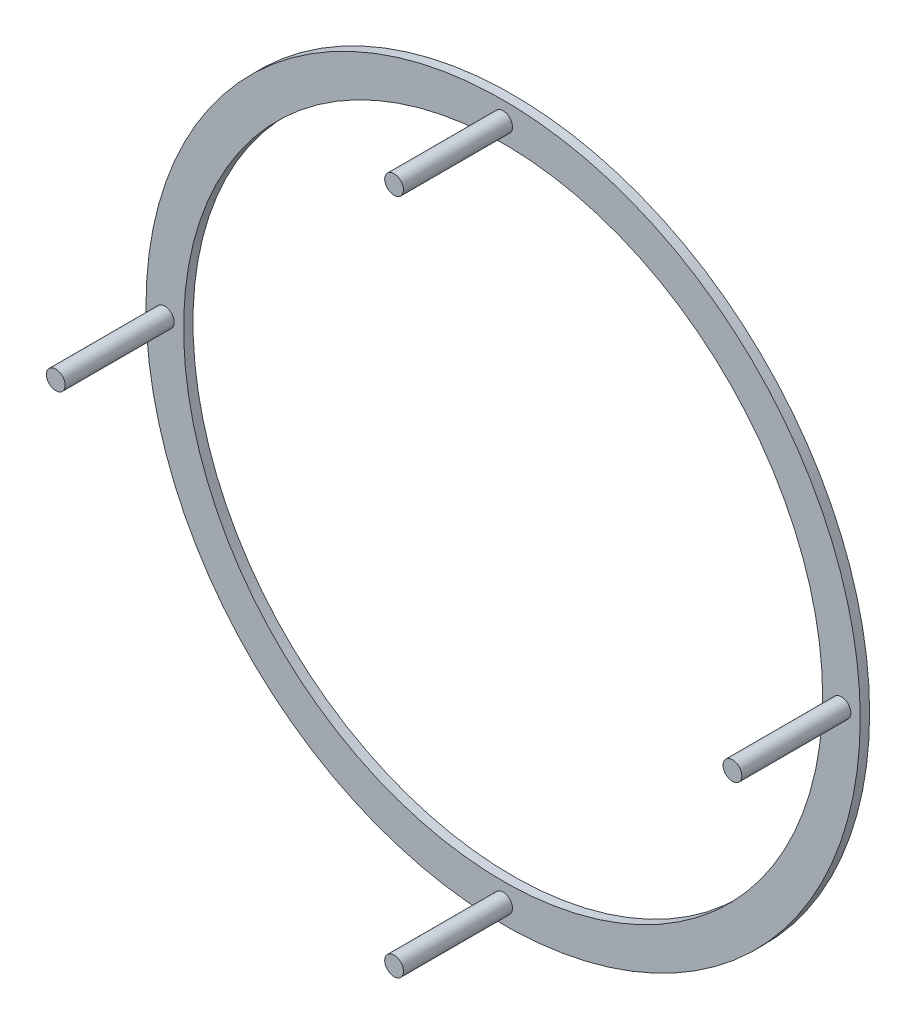
ISO-10303-21;
HEADER;
FILE_DESCRIPTION(('STEP AP214'),'2;1');
FILE_NAME('part.step','',(''),(''),'','','');
FILE_SCHEMA(('AUTOMOTIVE_DESIGN { 1 0 10303 214 1 1 1 1 }'));
ENDSEC;
DATA;
#1=APPLICATION_CONTEXT('core data for automotive mechanical design processes');
#2=APPLICATION_PROTOCOL_DEFINITION('international standard','automotive_design',2000,#1);
#3=PRODUCT_CONTEXT('',#1,'mechanical');
#4=PRODUCT('Part','Part','',(#3));
#5=PRODUCT_RELATED_PRODUCT_CATEGORY('part','',(#4));
#6=PRODUCT_DEFINITION_FORMATION('','',#4);
#7=PRODUCT_DEFINITION_CONTEXT('part definition',#1,'design');
#8=PRODUCT_DEFINITION('design','',#6,#7);
#9=PRODUCT_DEFINITION_SHAPE('','',#8);
#10=(LENGTH_UNIT() NAMED_UNIT(*) SI_UNIT(.MILLI.,.METRE.));
#11=(NAMED_UNIT(*) PLANE_ANGLE_UNIT() SI_UNIT($,.RADIAN.));
#12=(NAMED_UNIT(*) SI_UNIT($,.STERADIAN.) SOLID_ANGLE_UNIT());
#13=UNCERTAINTY_MEASURE_WITH_UNIT(LENGTH_MEASURE(1.E-05),#10,'distance_accuracy_value','');
#14=(GEOMETRIC_REPRESENTATION_CONTEXT(3) GLOBAL_UNCERTAINTY_ASSIGNED_CONTEXT((#13)) GLOBAL_UNIT_ASSIGNED_CONTEXT((#10,
#11,#12)) REPRESENTATION_CONTEXT('',''));
#15=CARTESIAN_POINT('',(0.,0.,0.));
#16=DIRECTION('',(0.,0.,1.));
#17=DIRECTION('',(1.,0.,0.));
#18=AXIS2_PLACEMENT_3D('',#15,#16,#17);
#19=CARTESIAN_POINT('',(0.,0.,5.));
#20=DIRECTION('',(0.,0.,1.));
#21=DIRECTION('',(1.,0.,0.));
#22=AXIS2_PLACEMENT_3D('',#19,#20,#21);
#23=PLANE('',#22);
#24=CARTESIAN_POINT('',(180.,0.,5.));
#25=DIRECTION('',(0.,0.,1.));
#26=DIRECTION('',(1.,0.,0.));
#27=AXIS2_PLACEMENT_3D('',#24,#25,#26);
#28=CIRCLE('',#27,4.99999999999999);
#29=CARTESIAN_POINT('',(175.,0.,5.));
#30=VERTEX_POINT('',#29);
#31=EDGE_CURVE('E70',#30,#30,#28,.T.);
#32=ORIENTED_EDGE('',*,*,#31,.F.);
#33=EDGE_LOOP('',(#32));
#34=FACE_BOUND('',#33,.T.);
#35=CARTESIAN_POINT('',(0.,-180.,5.));
#36=DIRECTION('',(0.,0.,1.));
#37=DIRECTION('',(1.,0.,0.));
#38=AXIS2_PLACEMENT_3D('',#35,#36,#37);
#39=CIRCLE('',#38,5.);
#40=CARTESIAN_POINT('',(-4.99999999999998,-180.,5.));
#41=VERTEX_POINT('',#40);
#42=EDGE_CURVE('E64',#41,#41,#39,.T.);
#43=ORIENTED_EDGE('',*,*,#42,.F.);
#44=EDGE_LOOP('',(#43));
#45=FACE_BOUND('',#44,.T.);
#46=CARTESIAN_POINT('',(-180.,0.,5.));
#47=DIRECTION('',(0.,0.,1.));
#48=DIRECTION('',(1.,0.,0.));
#49=AXIS2_PLACEMENT_3D('',#46,#47,#48);
#50=CIRCLE('',#49,4.99999999999999);
#51=CARTESIAN_POINT('',(-185.,0.,5.));
#52=VERTEX_POINT('',#51);
#53=EDGE_CURVE('E58',#52,#52,#50,.T.);
#54=ORIENTED_EDGE('',*,*,#53,.F.);
#55=EDGE_LOOP('',(#54));
#56=FACE_BOUND('',#55,.T.);
#57=CARTESIAN_POINT('',(0.,180.,5.));
#58=DIRECTION('',(0.,0.,1.));
#59=DIRECTION('',(1.,0.,0.));
#60=AXIS2_PLACEMENT_3D('',#57,#58,#59);
#61=CIRCLE('',#60,5.);
#62=CARTESIAN_POINT('',(-5.,180.,5.));
#63=VERTEX_POINT('',#62);
#64=EDGE_CURVE('E52',#63,#63,#61,.T.);
#65=ORIENTED_EDGE('',*,*,#64,.F.);
#66=EDGE_LOOP('',(#65));
#67=FACE_BOUND('',#66,.T.);
#68=CARTESIAN_POINT('',(0.,0.,5.));
#69=DIRECTION('',(0.,0.,1.));
#70=DIRECTION('',(1.,0.,0.));
#71=AXIS2_PLACEMENT_3D('',#68,#69,#70);
#72=CIRCLE('',#71,190.);
#73=CARTESIAN_POINT('',(190.,0.,5.));
#74=VERTEX_POINT('',#73);
#75=EDGE_CURVE('E10',#74,#74,#72,.T.);
#76=ORIENTED_EDGE('',*,*,#75,.T.);
#77=EDGE_LOOP('',(#76));
#78=FACE_BOUND('',#77,.T.);
#79=CARTESIAN_POINT('',(0.,0.,5.));
#80=DIRECTION('',(0.,0.,1.));
#81=DIRECTION('',(1.,0.,0.));
#82=AXIS2_PLACEMENT_3D('',#79,#80,#81);
#83=CIRCLE('',#82,170.);
#84=CARTESIAN_POINT('',(170.,0.,5.));
#85=VERTEX_POINT('',#84);
#86=EDGE_CURVE('E44',#85,#85,#83,.T.);
#87=ORIENTED_EDGE('',*,*,#86,.F.);
#88=EDGE_LOOP('',(#87));
#89=FACE_BOUND('',#88,.T.);
#90=ADVANCED_FACE('F33',(#34,#45,#56,#67,#78,#89),#23,.T.);
#91=CARTESIAN_POINT('',(0.,0.,0.));
#92=DIRECTION('',(0.,0.,1.));
#93=DIRECTION('',(1.,0.,0.));
#94=AXIS2_PLACEMENT_3D('',#91,#92,#93);
#95=PLANE('',#94);
#96=CARTESIAN_POINT('',(0.,0.,0.));
#97=DIRECTION('',(0.,0.,1.));
#98=DIRECTION('',(1.,0.,0.));
#99=AXIS2_PLACEMENT_3D('',#96,#97,#98);
#100=CIRCLE('',#99,190.);
#101=CARTESIAN_POINT('',(190.,0.,0.));
#102=VERTEX_POINT('',#101);
#103=EDGE_CURVE('E37',#102,#102,#100,.T.);
#104=ORIENTED_EDGE('',*,*,#103,.F.);
#105=EDGE_LOOP('',(#104));
#106=FACE_BOUND('',#105,.T.);
#107=CARTESIAN_POINT('',(0.,0.,0.));
#108=DIRECTION('',(0.,0.,1.));
#109=DIRECTION('',(1.,0.,0.));
#110=AXIS2_PLACEMENT_3D('',#107,#108,#109);
#111=CIRCLE('',#110,170.);
#112=CARTESIAN_POINT('',(170.,0.,0.));
#113=VERTEX_POINT('',#112);
#114=EDGE_CURVE('E46',#113,#113,#111,.T.);
#115=ORIENTED_EDGE('',*,*,#114,.T.);
#116=EDGE_LOOP('',(#115));
#117=FACE_BOUND('',#116,.T.);
#118=ADVANCED_FACE('F87',(#106,#117),#95,.F.);
#119=CARTESIAN_POINT('',(0.,0.,5.));
#120=DIRECTION('',(0.,0.,-1.));
#121=DIRECTION('',(-1.,0.,0.));
#122=AXIS2_PLACEMENT_3D('',#119,#120,#121);
#123=CYLINDRICAL_SURFACE('',#122,190.);
#124=ORIENTED_EDGE('',*,*,#75,.F.);
#125=EDGE_LOOP('',(#124));
#126=FACE_BOUND('',#125,.T.);
#127=ORIENTED_EDGE('',*,*,#103,.T.);
#128=EDGE_LOOP('',(#127));
#129=FACE_BOUND('',#128,.T.);
#130=ADVANCED_FACE('F35',(#126,#129),#123,.T.);
#131=CARTESIAN_POINT('',(0.,0.,5.));
#132=DIRECTION('',(0.,0.,-1.));
#133=DIRECTION('',(-1.,0.,0.));
#134=AXIS2_PLACEMENT_3D('',#131,#132,#133);
#135=CYLINDRICAL_SURFACE('',#134,170.);
#136=ORIENTED_EDGE('',*,*,#86,.T.);
#137=EDGE_LOOP('',(#136));
#138=FACE_BOUND('',#137,.T.);
#139=ORIENTED_EDGE('',*,*,#114,.F.);
#140=EDGE_LOOP('',(#139));
#141=FACE_BOUND('',#140,.T.);
#142=ADVANCED_FACE('F97',(#138,#141),#135,.F.);
#143=CARTESIAN_POINT('',(0.,180.,63.));
#144=DIRECTION('',(0.,0.,-1.));
#145=DIRECTION('',(-1.,0.,0.));
#146=AXIS2_PLACEMENT_3D('',#143,#144,#145);
#147=CYLINDRICAL_SURFACE('',#146,5.);
#148=CARTESIAN_POINT('',(0.,180.,63.));
#149=DIRECTION('',(0.,0.,1.));
#150=DIRECTION('',(1.,0.,0.));
#151=AXIS2_PLACEMENT_3D('',#148,#149,#150);
#152=CIRCLE('',#151,5.);
#153=CARTESIAN_POINT('',(-5.,180.,63.));
#154=VERTEX_POINT('',#153);
#155=EDGE_CURVE('E49',#154,#154,#152,.T.);
#156=CARTESIAN_POINT('',(-5.,180.,63.));
#157=CARTESIAN_POINT('',(-5.,180.,62.3958333333333));
#158=CARTESIAN_POINT('',(-5.,180.,61.7916666666667));
#159=CARTESIAN_POINT('',(-5.,180.,60.5833333333333));
#160=CARTESIAN_POINT('',(-5.,180.,59.9791666666667));
#161=CARTESIAN_POINT('',(-5.,180.,58.7708333333333));
#162=CARTESIAN_POINT('',(-5.,180.,58.1666666666667));
#163=CARTESIAN_POINT('',(-5.,180.,56.9583333333333));
#164=CARTESIAN_POINT('',(-5.,180.,56.3541666666667));
#165=CARTESIAN_POINT('',(-5.,180.,55.1458333333333));
#166=CARTESIAN_POINT('',(-5.,180.,54.5416666666667));
#167=CARTESIAN_POINT('',(-5.,180.,53.3333333333333));
#168=CARTESIAN_POINT('',(-5.,180.,52.7291666666667));
#169=CARTESIAN_POINT('',(-5.,180.,51.5208333333333));
#170=CARTESIAN_POINT('',(-5.,180.,50.9166666666667));
#171=CARTESIAN_POINT('',(-5.,180.,49.7083333333333));
#172=CARTESIAN_POINT('',(-5.,180.,49.1041666666667));
#173=CARTESIAN_POINT('',(-5.,180.,47.8958333333333));
#174=CARTESIAN_POINT('',(-5.,180.,47.2916666666667));
#175=CARTESIAN_POINT('',(-5.,180.,46.0833333333333));
#176=CARTESIAN_POINT('',(-5.,180.,45.4791666666667));
#177=CARTESIAN_POINT('',(-5.,180.,44.2708333333333));
#178=CARTESIAN_POINT('',(-5.,180.,43.6666666666667));
#179=CARTESIAN_POINT('',(-5.,180.,42.4583333333333));
#180=CARTESIAN_POINT('',(-5.,180.,41.8541666666667));
#181=CARTESIAN_POINT('',(-5.,180.,40.6458333333333));
#182=CARTESIAN_POINT('',(-5.,180.,40.0416666666667));
#183=CARTESIAN_POINT('',(-5.,180.,38.8333333333333));
#184=CARTESIAN_POINT('',(-5.,180.,38.2291666666667));
#185=CARTESIAN_POINT('',(-5.,180.,37.0208333333333));
#186=CARTESIAN_POINT('',(-5.,180.,36.4166666666667));
#187=CARTESIAN_POINT('',(-5.,180.,35.2083333333333));
#188=CARTESIAN_POINT('',(-5.,180.,34.6041666666667));
#189=CARTESIAN_POINT('',(-5.,180.,33.3958333333333));
#190=CARTESIAN_POINT('',(-5.,180.,32.7916666666667));
#191=CARTESIAN_POINT('',(-5.,180.,31.5833333333333));
#192=CARTESIAN_POINT('',(-5.,180.,30.9791666666667));
#193=CARTESIAN_POINT('',(-5.,180.,29.7708333333333));
#194=CARTESIAN_POINT('',(-5.,180.,29.1666666666667));
#195=CARTESIAN_POINT('',(-5.,180.,27.9583333333333));
#196=CARTESIAN_POINT('',(-5.,180.,27.3541666666667));
#197=CARTESIAN_POINT('',(-5.,180.,26.1458333333333));
#198=CARTESIAN_POINT('',(-5.,180.,25.5416666666667));
#199=CARTESIAN_POINT('',(-5.,180.,24.3333333333333));
#200=CARTESIAN_POINT('',(-5.,180.,23.7291666666667));
#201=CARTESIAN_POINT('',(-5.,180.,22.5208333333333));
#202=CARTESIAN_POINT('',(-5.,180.,21.9166666666667));
#203=CARTESIAN_POINT('',(-5.,180.,20.7083333333333));
#204=CARTESIAN_POINT('',(-5.,180.,20.1041666666667));
#205=CARTESIAN_POINT('',(-5.,180.,18.8958333333333));
#206=CARTESIAN_POINT('',(-5.,180.,18.2916666666667));
#207=CARTESIAN_POINT('',(-5.,180.,17.0833333333333));
#208=CARTESIAN_POINT('',(-5.,180.,16.4791666666667));
#209=CARTESIAN_POINT('',(-5.,180.,15.2708333333333));
#210=CARTESIAN_POINT('',(-5.,180.,14.6666666666667));
#211=CARTESIAN_POINT('',(-5.,180.,13.4583333333333));
#212=CARTESIAN_POINT('',(-5.,180.,12.8541666666667));
#213=CARTESIAN_POINT('',(-5.,180.,11.6458333333333));
#214=CARTESIAN_POINT('',(-5.,180.,11.0416666666667));
#215=CARTESIAN_POINT('',(-5.,180.,9.83333333333333));
#216=CARTESIAN_POINT('',(-5.,180.,9.22916666666666));
#217=CARTESIAN_POINT('',(-5.,180.,8.02083333333333));
#218=CARTESIAN_POINT('',(-5.,180.,7.41666666666667));
#219=CARTESIAN_POINT('',(-5.,180.,6.20833333333333));
#220=CARTESIAN_POINT('',(-5.,180.,5.60416666666666));
#221=CARTESIAN_POINT('',(-5.,180.,5.));
#222=B_SPLINE_CURVE_WITH_KNOTS('',3,(#156,#157,#158,#159,#160,#161,#162,#163,#164,#165,#166,
#167,#168,#169,#170,#171,#172,#173,#174,#175,#176,#177,#178,#179,#180,#181,#182,#183,#184,#185,
#186,#187,#188,#189,#190,#191,#192,#193,#194,#195,#196,#197,#198,#199,#200,#201,#202,#203,#204,
#205,#206,#207,#208,#209,#210,#211,#212,#213,#214,#215,#216,#217,#218,#219,#220,#221),
.UNSPECIFIED.,.F.,.F.,(4,2,2,2,2,2,2,2,2,2,2,2,2,2,2,2,2,2,2,2,2,2,2,2,2,2,2,2,2,2,2,2,4),(0.,
1.81250000000001,3.625,5.4375,7.25000000000001,9.06250000000001,10.875,12.6875,14.5,16.3125,
18.125,19.9375,21.75,23.5625,25.375,27.1875,29.,30.8125,32.625,34.4375,36.25,38.0625,39.875,
41.6875,43.5,45.3125,47.125,48.9375,50.75,52.5625,54.375,56.1875,58.),.UNSPECIFIED.);
#223=EDGE_CURVE('BSEAM100',#154,#63,#222,.T.);
#224=ORIENTED_EDGE('',*,*,#155,.F.);
#225=ORIENTED_EDGE('',*,*,#64,.T.);
#226=ORIENTED_EDGE('',*,*,#223,.T.);
#227=ORIENTED_EDGE('',*,*,#223,.F.);
#228=EDGE_LOOP('',(#224,#226,#225,#227));
#229=FACE_BOUND('',#228,.T.);
#230=ADVANCED_FACE('F100',(#229),#147,.T.);
#231=CARTESIAN_POINT('',(0.,180.,63.));
#232=DIRECTION('',(0.,0.,1.));
#233=DIRECTION('',(1.,0.,0.));
#234=AXIS2_PLACEMENT_3D('',#231,#232,#233);
#235=PLANE('',#234);
#236=ORIENTED_EDGE('',*,*,#155,.T.);
#237=EDGE_LOOP('',(#236));
#238=FACE_BOUND('',#237,.T.);
#239=ADVANCED_FACE('F114',(#238),#235,.T.);
#240=CARTESIAN_POINT('',(-180.,0.,63.));
#241=DIRECTION('',(0.,0.,-1.));
#242=DIRECTION('',(-1.,0.,0.));
#243=AXIS2_PLACEMENT_3D('',#240,#241,#242);
#244=CYLINDRICAL_SURFACE('',#243,4.99999999999999);
#245=CARTESIAN_POINT('',(-180.,0.,63.));
#246=DIRECTION('',(0.,0.,1.));
#247=DIRECTION('',(1.,0.,0.));
#248=AXIS2_PLACEMENT_3D('',#245,#246,#247);
#249=CIRCLE('',#248,4.99999999999999);
#250=CARTESIAN_POINT('',(-185.,0.,63.));
#251=VERTEX_POINT('',#250);
#252=EDGE_CURVE('E55',#251,#251,#249,.T.);
#253=CARTESIAN_POINT('',(-185.,0.,63.));
#254=CARTESIAN_POINT('',(-185.,0.,62.3958333333333));
#255=CARTESIAN_POINT('',(-185.,0.,61.7916666666667));
#256=CARTESIAN_POINT('',(-185.,0.,60.5833333333333));
#257=CARTESIAN_POINT('',(-185.,0.,59.9791666666667));
#258=CARTESIAN_POINT('',(-185.,0.,58.7708333333333));
#259=CARTESIAN_POINT('',(-185.,0.,58.1666666666667));
#260=CARTESIAN_POINT('',(-185.,0.,56.9583333333333));
#261=CARTESIAN_POINT('',(-185.,0.,56.3541666666667));
#262=CARTESIAN_POINT('',(-185.,0.,55.1458333333333));
#263=CARTESIAN_POINT('',(-185.,0.,54.5416666666667));
#264=CARTESIAN_POINT('',(-185.,0.,53.3333333333333));
#265=CARTESIAN_POINT('',(-185.,0.,52.7291666666667));
#266=CARTESIAN_POINT('',(-185.,0.,51.5208333333333));
#267=CARTESIAN_POINT('',(-185.,0.,50.9166666666667));
#268=CARTESIAN_POINT('',(-185.,0.,49.7083333333333));
#269=CARTESIAN_POINT('',(-185.,0.,49.1041666666667));
#270=CARTESIAN_POINT('',(-185.,0.,47.8958333333333));
#271=CARTESIAN_POINT('',(-185.,0.,47.2916666666667));
#272=CARTESIAN_POINT('',(-185.,0.,46.0833333333333));
#273=CARTESIAN_POINT('',(-185.,0.,45.4791666666667));
#274=CARTESIAN_POINT('',(-185.,0.,44.2708333333333));
#275=CARTESIAN_POINT('',(-185.,0.,43.6666666666667));
#276=CARTESIAN_POINT('',(-185.,0.,42.4583333333333));
#277=CARTESIAN_POINT('',(-185.,0.,41.8541666666667));
#278=CARTESIAN_POINT('',(-185.,0.,40.6458333333333));
#279=CARTESIAN_POINT('',(-185.,0.,40.0416666666667));
#280=CARTESIAN_POINT('',(-185.,0.,38.8333333333333));
#281=CARTESIAN_POINT('',(-185.,0.,38.2291666666667));
#282=CARTESIAN_POINT('',(-185.,0.,37.0208333333333));
#283=CARTESIAN_POINT('',(-185.,0.,36.4166666666667));
#284=CARTESIAN_POINT('',(-185.,0.,35.2083333333333));
#285=CARTESIAN_POINT('',(-185.,0.,34.6041666666667));
#286=CARTESIAN_POINT('',(-185.,0.,33.3958333333333));
#287=CARTESIAN_POINT('',(-185.,0.,32.7916666666667));
#288=CARTESIAN_POINT('',(-185.,0.,31.5833333333333));
#289=CARTESIAN_POINT('',(-185.,0.,30.9791666666667));
#290=CARTESIAN_POINT('',(-185.,0.,29.7708333333333));
#291=CARTESIAN_POINT('',(-185.,0.,29.1666666666667));
#292=CARTESIAN_POINT('',(-185.,0.,27.9583333333333));
#293=CARTESIAN_POINT('',(-185.,0.,27.3541666666667));
#294=CARTESIAN_POINT('',(-185.,0.,26.1458333333333));
#295=CARTESIAN_POINT('',(-185.,0.,25.5416666666667));
#296=CARTESIAN_POINT('',(-185.,0.,24.3333333333333));
#297=CARTESIAN_POINT('',(-185.,0.,23.7291666666667));
#298=CARTESIAN_POINT('',(-185.,0.,22.5208333333333));
#299=CARTESIAN_POINT('',(-185.,0.,21.9166666666667));
#300=CARTESIAN_POINT('',(-185.,0.,20.7083333333333));
#301=CARTESIAN_POINT('',(-185.,0.,20.1041666666667));
#302=CARTESIAN_POINT('',(-185.,0.,18.8958333333333));
#303=CARTESIAN_POINT('',(-185.,0.,18.2916666666667));
#304=CARTESIAN_POINT('',(-185.,0.,17.0833333333333));
#305=CARTESIAN_POINT('',(-185.,0.,16.4791666666667));
#306=CARTESIAN_POINT('',(-185.,0.,15.2708333333333));
#307=CARTESIAN_POINT('',(-185.,0.,14.6666666666667));
#308=CARTESIAN_POINT('',(-185.,0.,13.4583333333333));
#309=CARTESIAN_POINT('',(-185.,0.,12.8541666666667));
#310=CARTESIAN_POINT('',(-185.,0.,11.6458333333333));
#311=CARTESIAN_POINT('',(-185.,0.,11.0416666666667));
#312=CARTESIAN_POINT('',(-185.,0.,9.83333333333333));
#313=CARTESIAN_POINT('',(-185.,0.,9.22916666666666));
#314=CARTESIAN_POINT('',(-185.,0.,8.02083333333333));
#315=CARTESIAN_POINT('',(-185.,0.,7.41666666666667));
#316=CARTESIAN_POINT('',(-185.,0.,6.20833333333333));
#317=CARTESIAN_POINT('',(-185.,0.,5.60416666666666));
#318=CARTESIAN_POINT('',(-185.,0.,5.));
#319=B_SPLINE_CURVE_WITH_KNOTS('',3,(#253,#254,#255,#256,#257,#258,#259,#260,#261,#262,#263,
#264,#265,#266,#267,#268,#269,#270,#271,#272,#273,#274,#275,#276,#277,#278,#279,#280,#281,#282,
#283,#284,#285,#286,#287,#288,#289,#290,#291,#292,#293,#294,#295,#296,#297,#298,#299,#300,#301,
#302,#303,#304,#305,#306,#307,#308,#309,#310,#311,#312,#313,#314,#315,#316,#317,#318),
.UNSPECIFIED.,.F.,.F.,(4,2,2,2,2,2,2,2,2,2,2,2,2,2,2,2,2,2,2,2,2,2,2,2,2,2,2,2,2,2,2,2,4),(0.,
1.81250000000001,3.625,5.4375,7.25000000000001,9.06250000000001,10.875,12.6875,14.5,16.3125,
18.125,19.9375,21.75,23.5625,25.375,27.1875,29.,30.8125,32.625,34.4375,36.25,38.0625,39.875,
41.6875,43.5,45.3125,47.125,48.9375,50.75,52.5625,54.375,56.1875,58.),.UNSPECIFIED.);
#320=EDGE_CURVE('BSEAM118',#251,#52,#319,.T.);
#321=ORIENTED_EDGE('',*,*,#252,.F.);
#322=ORIENTED_EDGE('',*,*,#53,.T.);
#323=ORIENTED_EDGE('',*,*,#320,.T.);
#324=ORIENTED_EDGE('',*,*,#320,.F.);
#325=EDGE_LOOP('',(#321,#323,#322,#324));
#326=FACE_BOUND('',#325,.T.);
#327=ADVANCED_FACE('F118',(#326),#244,.T.);
#328=CARTESIAN_POINT('',(-180.,0.,63.));
#329=DIRECTION('',(0.,0.,1.));
#330=DIRECTION('',(1.,0.,0.));
#331=AXIS2_PLACEMENT_3D('',#328,#329,#330);
#332=PLANE('',#331);
#333=ORIENTED_EDGE('',*,*,#252,.T.);
#334=EDGE_LOOP('',(#333));
#335=FACE_BOUND('',#334,.T.);
#336=ADVANCED_FACE('F122',(#335),#332,.T.);
#337=CARTESIAN_POINT('',(0.,-180.,63.));
#338=DIRECTION('',(0.,0.,-1.));
#339=DIRECTION('',(-1.,0.,0.));
#340=AXIS2_PLACEMENT_3D('',#337,#338,#339);
#341=CYLINDRICAL_SURFACE('',#340,5.);
#342=CARTESIAN_POINT('',(0.,-180.,63.));
#343=DIRECTION('',(0.,0.,1.));
#344=DIRECTION('',(1.,0.,0.));
#345=AXIS2_PLACEMENT_3D('',#342,#343,#344);
#346=CIRCLE('',#345,5.);
#347=CARTESIAN_POINT('',(-4.99999999999998,-180.,63.));
#348=VERTEX_POINT('',#347);
#349=EDGE_CURVE('E61',#348,#348,#346,.T.);
#350=CARTESIAN_POINT('',(-4.99999999999998,-180.,63.));
#351=CARTESIAN_POINT('',(-4.99999999999998,-180.,62.3958333333333));
#352=CARTESIAN_POINT('',(-4.99999999999998,-180.,61.7916666666667));
#353=CARTESIAN_POINT('',(-4.99999999999998,-180.,60.5833333333333));
#354=CARTESIAN_POINT('',(-4.99999999999998,-180.,59.9791666666667));
#355=CARTESIAN_POINT('',(-4.99999999999998,-180.,58.7708333333333));
#356=CARTESIAN_POINT('',(-4.99999999999998,-180.,58.1666666666667));
#357=CARTESIAN_POINT('',(-4.99999999999998,-180.,56.9583333333333));
#358=CARTESIAN_POINT('',(-4.99999999999998,-180.,56.3541666666667));
#359=CARTESIAN_POINT('',(-4.99999999999998,-180.,55.1458333333333));
#360=CARTESIAN_POINT('',(-4.99999999999998,-180.,54.5416666666667));
#361=CARTESIAN_POINT('',(-4.99999999999998,-180.,53.3333333333333));
#362=CARTESIAN_POINT('',(-4.99999999999998,-180.,52.7291666666667));
#363=CARTESIAN_POINT('',(-4.99999999999998,-180.,51.5208333333333));
#364=CARTESIAN_POINT('',(-4.99999999999998,-180.,50.9166666666667));
#365=CARTESIAN_POINT('',(-4.99999999999998,-180.,49.7083333333333));
#366=CARTESIAN_POINT('',(-4.99999999999998,-180.,49.1041666666667));
#367=CARTESIAN_POINT('',(-4.99999999999998,-180.,47.8958333333333));
#368=CARTESIAN_POINT('',(-4.99999999999998,-180.,47.2916666666667));
#369=CARTESIAN_POINT('',(-4.99999999999998,-180.,46.0833333333333));
#370=CARTESIAN_POINT('',(-4.99999999999998,-180.,45.4791666666667));
#371=CARTESIAN_POINT('',(-4.99999999999998,-180.,44.2708333333333));
#372=CARTESIAN_POINT('',(-4.99999999999998,-180.,43.6666666666667));
#373=CARTESIAN_POINT('',(-4.99999999999998,-180.,42.4583333333333));
#374=CARTESIAN_POINT('',(-4.99999999999998,-180.,41.8541666666667));
#375=CARTESIAN_POINT('',(-4.99999999999998,-180.,40.6458333333333));
#376=CARTESIAN_POINT('',(-4.99999999999998,-180.,40.0416666666667));
#377=CARTESIAN_POINT('',(-4.99999999999998,-180.,38.8333333333333));
#378=CARTESIAN_POINT('',(-4.99999999999998,-180.,38.2291666666667));
#379=CARTESIAN_POINT('',(-4.99999999999998,-180.,37.0208333333333));
#380=CARTESIAN_POINT('',(-4.99999999999998,-180.,36.4166666666667));
#381=CARTESIAN_POINT('',(-4.99999999999998,-180.,35.2083333333333));
#382=CARTESIAN_POINT('',(-4.99999999999998,-180.,34.6041666666667));
#383=CARTESIAN_POINT('',(-4.99999999999998,-180.,33.3958333333333));
#384=CARTESIAN_POINT('',(-4.99999999999998,-180.,32.7916666666667));
#385=CARTESIAN_POINT('',(-4.99999999999998,-180.,31.5833333333333));
#386=CARTESIAN_POINT('',(-4.99999999999998,-180.,30.9791666666667));
#387=CARTESIAN_POINT('',(-4.99999999999998,-180.,29.7708333333333));
#388=CARTESIAN_POINT('',(-4.99999999999998,-180.,29.1666666666667));
#389=CARTESIAN_POINT('',(-4.99999999999998,-180.,27.9583333333333));
#390=CARTESIAN_POINT('',(-4.99999999999998,-180.,27.3541666666667));
#391=CARTESIAN_POINT('',(-4.99999999999998,-180.,26.1458333333333));
#392=CARTESIAN_POINT('',(-4.99999999999998,-180.,25.5416666666667));
#393=CARTESIAN_POINT('',(-4.99999999999998,-180.,24.3333333333333));
#394=CARTESIAN_POINT('',(-4.99999999999998,-180.,23.7291666666667));
#395=CARTESIAN_POINT('',(-4.99999999999998,-180.,22.5208333333333));
#396=CARTESIAN_POINT('',(-4.99999999999998,-180.,21.9166666666667));
#397=CARTESIAN_POINT('',(-4.99999999999998,-180.,20.7083333333333));
#398=CARTESIAN_POINT('',(-4.99999999999998,-180.,20.1041666666667));
#399=CARTESIAN_POINT('',(-4.99999999999998,-180.,18.8958333333333));
#400=CARTESIAN_POINT('',(-4.99999999999998,-180.,18.2916666666667));
#401=CARTESIAN_POINT('',(-4.99999999999998,-180.,17.0833333333333));
#402=CARTESIAN_POINT('',(-4.99999999999998,-180.,16.4791666666667));
#403=CARTESIAN_POINT('',(-4.99999999999998,-180.,15.2708333333333));
#404=CARTESIAN_POINT('',(-4.99999999999998,-180.,14.6666666666667));
#405=CARTESIAN_POINT('',(-4.99999999999998,-180.,13.4583333333333));
#406=CARTESIAN_POINT('',(-4.99999999999998,-180.,12.8541666666667));
#407=CARTESIAN_POINT('',(-4.99999999999998,-180.,11.6458333333333));
#408=CARTESIAN_POINT('',(-4.99999999999998,-180.,11.0416666666667));
#409=CARTESIAN_POINT('',(-4.99999999999998,-180.,9.83333333333333));
#410=CARTESIAN_POINT('',(-4.99999999999998,-180.,9.22916666666666));
#411=CARTESIAN_POINT('',(-4.99999999999998,-180.,8.02083333333333));
#412=CARTESIAN_POINT('',(-4.99999999999998,-180.,7.41666666666667));
#413=CARTESIAN_POINT('',(-4.99999999999998,-180.,6.20833333333333));
#414=CARTESIAN_POINT('',(-4.99999999999998,-180.,5.60416666666666));
#415=CARTESIAN_POINT('',(-4.99999999999998,-180.,5.));
#416=B_SPLINE_CURVE_WITH_KNOTS('',3,(#350,#351,#352,#353,#354,#355,#356,#357,#358,#359,#360,
#361,#362,#363,#364,#365,#366,#367,#368,#369,#370,#371,#372,#373,#374,#375,#376,#377,#378,#379,
#380,#381,#382,#383,#384,#385,#386,#387,#388,#389,#390,#391,#392,#393,#394,#395,#396,#397,#398,
#399,#400,#401,#402,#403,#404,#405,#406,#407,#408,#409,#410,#411,#412,#413,#414,#415),
.UNSPECIFIED.,.F.,.F.,(4,2,2,2,2,2,2,2,2,2,2,2,2,2,2,2,2,2,2,2,2,2,2,2,2,2,2,2,2,2,2,2,4),(0.,
1.81250000000001,3.625,5.4375,7.25000000000001,9.06250000000001,10.875,12.6875,14.5,16.3125,
18.125,19.9375,21.75,23.5625,25.375,27.1875,29.,30.8125,32.625,34.4375,36.25,38.0625,39.875,
41.6875,43.5,45.3125,47.125,48.9375,50.75,52.5625,54.375,56.1875,58.),.UNSPECIFIED.);
#417=EDGE_CURVE('BSEAM126',#348,#41,#416,.T.);
#418=ORIENTED_EDGE('',*,*,#349,.F.);
#419=ORIENTED_EDGE('',*,*,#42,.T.);
#420=ORIENTED_EDGE('',*,*,#417,.T.);
#421=ORIENTED_EDGE('',*,*,#417,.F.);
#422=EDGE_LOOP('',(#418,#420,#419,#421));
#423=FACE_BOUND('',#422,.T.);
#424=ADVANCED_FACE('F126',(#423),#341,.T.);
#425=CARTESIAN_POINT('',(0.,-180.,63.));
#426=DIRECTION('',(0.,0.,1.));
#427=DIRECTION('',(1.,0.,0.));
#428=AXIS2_PLACEMENT_3D('',#425,#426,#427);
#429=PLANE('',#428);
#430=ORIENTED_EDGE('',*,*,#349,.T.);
#431=EDGE_LOOP('',(#430));
#432=FACE_BOUND('',#431,.T.);
#433=ADVANCED_FACE('F81',(#432),#429,.T.);
#434=CARTESIAN_POINT('',(180.,0.,63.));
#435=DIRECTION('',(0.,0.,-1.));
#436=DIRECTION('',(-1.,0.,0.));
#437=AXIS2_PLACEMENT_3D('',#434,#435,#436);
#438=CYLINDRICAL_SURFACE('',#437,4.99999999999999);
#439=CARTESIAN_POINT('',(180.,0.,63.));
#440=DIRECTION('',(0.,0.,1.));
#441=DIRECTION('',(1.,0.,0.));
#442=AXIS2_PLACEMENT_3D('',#439,#440,#441);
#443=CIRCLE('',#442,4.99999999999999);
#444=CARTESIAN_POINT('',(175.,0.,63.));
#445=VERTEX_POINT('',#444);
#446=EDGE_CURVE('E67',#445,#445,#443,.T.);
#447=CARTESIAN_POINT('',(175.,0.,63.));
#448=CARTESIAN_POINT('',(175.,0.,62.3958333333333));
#449=CARTESIAN_POINT('',(175.,0.,61.7916666666667));
#450=CARTESIAN_POINT('',(175.,0.,60.5833333333333));
#451=CARTESIAN_POINT('',(175.,0.,59.9791666666667));
#452=CARTESIAN_POINT('',(175.,0.,58.7708333333333));
#453=CARTESIAN_POINT('',(175.,0.,58.1666666666667));
#454=CARTESIAN_POINT('',(175.,0.,56.9583333333333));
#455=CARTESIAN_POINT('',(175.,0.,56.3541666666667));
#456=CARTESIAN_POINT('',(175.,0.,55.1458333333333));
#457=CARTESIAN_POINT('',(175.,0.,54.5416666666667));
#458=CARTESIAN_POINT('',(175.,0.,53.3333333333333));
#459=CARTESIAN_POINT('',(175.,0.,52.7291666666667));
#460=CARTESIAN_POINT('',(175.,0.,51.5208333333333));
#461=CARTESIAN_POINT('',(175.,0.,50.9166666666667));
#462=CARTESIAN_POINT('',(175.,0.,49.7083333333333));
#463=CARTESIAN_POINT('',(175.,0.,49.1041666666667));
#464=CARTESIAN_POINT('',(175.,0.,47.8958333333333));
#465=CARTESIAN_POINT('',(175.,0.,47.2916666666667));
#466=CARTESIAN_POINT('',(175.,0.,46.0833333333333));
#467=CARTESIAN_POINT('',(175.,0.,45.4791666666667));
#468=CARTESIAN_POINT('',(175.,0.,44.2708333333333));
#469=CARTESIAN_POINT('',(175.,0.,43.6666666666667));
#470=CARTESIAN_POINT('',(175.,0.,42.4583333333333));
#471=CARTESIAN_POINT('',(175.,0.,41.8541666666667));
#472=CARTESIAN_POINT('',(175.,0.,40.6458333333333));
#473=CARTESIAN_POINT('',(175.,0.,40.0416666666667));
#474=CARTESIAN_POINT('',(175.,0.,38.8333333333333));
#475=CARTESIAN_POINT('',(175.,0.,38.2291666666667));
#476=CARTESIAN_POINT('',(175.,0.,37.0208333333333));
#477=CARTESIAN_POINT('',(175.,0.,36.4166666666667));
#478=CARTESIAN_POINT('',(175.,0.,35.2083333333333));
#479=CARTESIAN_POINT('',(175.,0.,34.6041666666667));
#480=CARTESIAN_POINT('',(175.,0.,33.3958333333333));
#481=CARTESIAN_POINT('',(175.,0.,32.7916666666667));
#482=CARTESIAN_POINT('',(175.,0.,31.5833333333333));
#483=CARTESIAN_POINT('',(175.,0.,30.9791666666667));
#484=CARTESIAN_POINT('',(175.,0.,29.7708333333333));
#485=CARTESIAN_POINT('',(175.,0.,29.1666666666667));
#486=CARTESIAN_POINT('',(175.,0.,27.9583333333333));
#487=CARTESIAN_POINT('',(175.,0.,27.3541666666667));
#488=CARTESIAN_POINT('',(175.,0.,26.1458333333333));
#489=CARTESIAN_POINT('',(175.,0.,25.5416666666667));
#490=CARTESIAN_POINT('',(175.,0.,24.3333333333333));
#491=CARTESIAN_POINT('',(175.,0.,23.7291666666667));
#492=CARTESIAN_POINT('',(175.,0.,22.5208333333333));
#493=CARTESIAN_POINT('',(175.,0.,21.9166666666667));
#494=CARTESIAN_POINT('',(175.,0.,20.7083333333333));
#495=CARTESIAN_POINT('',(175.,0.,20.1041666666667));
#496=CARTESIAN_POINT('',(175.,0.,18.8958333333333));
#497=CARTESIAN_POINT('',(175.,0.,18.2916666666667));
#498=CARTESIAN_POINT('',(175.,0.,17.0833333333333));
#499=CARTESIAN_POINT('',(175.,0.,16.4791666666667));
#500=CARTESIAN_POINT('',(175.,0.,15.2708333333333));
#501=CARTESIAN_POINT('',(175.,0.,14.6666666666667));
#502=CARTESIAN_POINT('',(175.,0.,13.4583333333333));
#503=CARTESIAN_POINT('',(175.,0.,12.8541666666667));
#504=CARTESIAN_POINT('',(175.,0.,11.6458333333333));
#505=CARTESIAN_POINT('',(175.,0.,11.0416666666667));
#506=CARTESIAN_POINT('',(175.,0.,9.83333333333333));
#507=CARTESIAN_POINT('',(175.,0.,9.22916666666666));
#508=CARTESIAN_POINT('',(175.,0.,8.02083333333333));
#509=CARTESIAN_POINT('',(175.,0.,7.41666666666667));
#510=CARTESIAN_POINT('',(175.,0.,6.20833333333333));
#511=CARTESIAN_POINT('',(175.,0.,5.60416666666666));
#512=CARTESIAN_POINT('',(175.,0.,5.));
#513=B_SPLINE_CURVE_WITH_KNOTS('',3,(#447,#448,#449,#450,#451,#452,#453,#454,#455,#456,#457,
#458,#459,#460,#461,#462,#463,#464,#465,#466,#467,#468,#469,#470,#471,#472,#473,#474,#475,#476,
#477,#478,#479,#480,#481,#482,#483,#484,#485,#486,#487,#488,#489,#490,#491,#492,#493,#494,#495,
#496,#497,#498,#499,#500,#501,#502,#503,#504,#505,#506,#507,#508,#509,#510,#511,#512),
.UNSPECIFIED.,.F.,.F.,(4,2,2,2,2,2,2,2,2,2,2,2,2,2,2,2,2,2,2,2,2,2,2,2,2,2,2,2,2,2,2,2,4),(0.,
1.81250000000001,3.625,5.4375,7.25000000000001,9.06250000000001,10.875,12.6875,14.5,16.3125,
18.125,19.9375,21.75,23.5625,25.375,27.1875,29.,30.8125,32.625,34.4375,36.25,38.0625,39.875,
41.6875,43.5,45.3125,47.125,48.9375,50.75,52.5625,54.375,56.1875,58.),.UNSPECIFIED.);
#514=EDGE_CURVE('BSEAM78',#445,#30,#513,.T.);
#515=ORIENTED_EDGE('',*,*,#446,.F.);
#516=ORIENTED_EDGE('',*,*,#31,.T.);
#517=ORIENTED_EDGE('',*,*,#514,.T.);
#518=ORIENTED_EDGE('',*,*,#514,.F.);
#519=EDGE_LOOP('',(#515,#517,#516,#518));
#520=FACE_BOUND('',#519,.T.);
#521=ADVANCED_FACE('F78',(#520),#438,.T.);
#522=CARTESIAN_POINT('',(180.,0.,63.));
#523=DIRECTION('',(0.,0.,1.));
#524=DIRECTION('',(1.,0.,0.));
#525=AXIS2_PLACEMENT_3D('',#522,#523,#524);
#526=PLANE('',#525);
#527=ORIENTED_EDGE('',*,*,#446,.T.);
#528=EDGE_LOOP('',(#527));
#529=FACE_BOUND('',#528,.T.);
#530=ADVANCED_FACE('F76',(#529),#526,.T.);
#531=CLOSED_SHELL('',(#90,#118,#130,#142,#230,#239,#327,#336,#424,#433,#521,#530));
#532=MANIFOLD_SOLID_BREP('B2',#531);
#533=ADVANCED_BREP_SHAPE_REPRESENTATION('',(#18,#532),#14);
#534=SHAPE_DEFINITION_REPRESENTATION(#9,#533);
ENDSEC;
END-ISO-10303-21;
